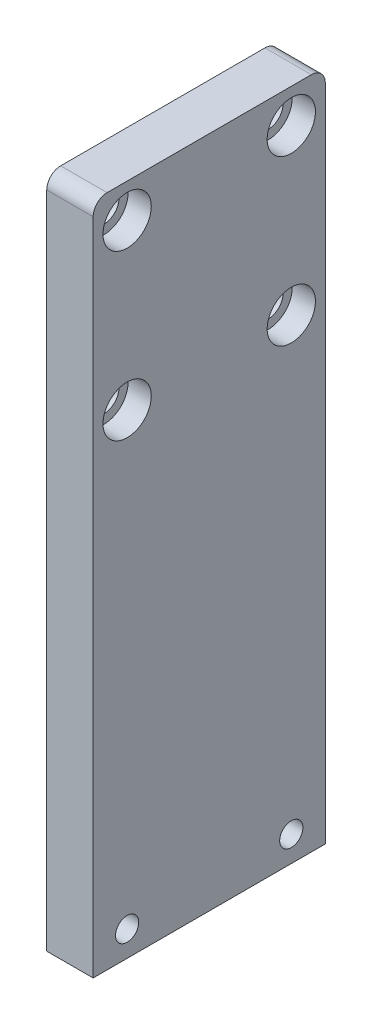
ISO-10303-21;
HEADER;
FILE_DESCRIPTION(('STEP AP214'),'2;1');
FILE_NAME('part.step','',(''),(''),'','','');
FILE_SCHEMA(('AUTOMOTIVE_DESIGN { 1 0 10303 214 1 1 1 1 }'));
ENDSEC;
DATA;
#1=APPLICATION_CONTEXT('core data for automotive mechanical design processes');
#2=APPLICATION_PROTOCOL_DEFINITION('international standard','automotive_design',2000,#1);
#3=PRODUCT_CONTEXT('',#1,'mechanical');
#4=PRODUCT('Part','Part','',(#3));
#5=PRODUCT_RELATED_PRODUCT_CATEGORY('part','',(#4));
#6=PRODUCT_DEFINITION_FORMATION('','',#4);
#7=PRODUCT_DEFINITION_CONTEXT('part definition',#1,'design');
#8=PRODUCT_DEFINITION('design','',#6,#7);
#9=PRODUCT_DEFINITION_SHAPE('','',#8);
#10=(LENGTH_UNIT() NAMED_UNIT(*) SI_UNIT(.MILLI.,.METRE.));
#11=(NAMED_UNIT(*) PLANE_ANGLE_UNIT() SI_UNIT($,.RADIAN.));
#12=(NAMED_UNIT(*) SI_UNIT($,.STERADIAN.) SOLID_ANGLE_UNIT());
#13=UNCERTAINTY_MEASURE_WITH_UNIT(LENGTH_MEASURE(1.E-05),#10,'distance_accuracy_value','');
#14=(GEOMETRIC_REPRESENTATION_CONTEXT(3) GLOBAL_UNCERTAINTY_ASSIGNED_CONTEXT((#13)) GLOBAL_UNIT_ASSIGNED_CONTEXT((#10,
#11,#12)) REPRESENTATION_CONTEXT('',''));
#15=CARTESIAN_POINT('',(0.,0.,0.));
#16=DIRECTION('',(0.,0.,1.));
#17=DIRECTION('',(1.,0.,0.));
#18=AXIS2_PLACEMENT_3D('',#15,#16,#17);
#19=CARTESIAN_POINT('',(10.,17.68,17.68));
#20=DIRECTION('',(-1.,0.,0.));
#21=DIRECTION('',(0.,0.,1.));
#22=AXIS2_PLACEMENT_3D('',#19,#20,#21);
#23=CYLINDRICAL_SURFACE('',#22,3.25);
#24=CARTESIAN_POINT('',(0.,17.68,17.68));
#25=DIRECTION('',(1.,0.,0.));
#26=DIRECTION('',(0.,0.,-1.));
#27=AXIS2_PLACEMENT_3D('',#24,#25,#26);
#28=CIRCLE('',#27,3.25);
#29=CARTESIAN_POINT('',(0.,17.68,14.43));
#30=VERTEX_POINT('',#29);
#31=EDGE_CURVE('E138',#30,#30,#28,.T.);
#32=ORIENTED_EDGE('',*,*,#31,.F.);
#33=EDGE_LOOP('',(#32));
#34=FACE_BOUND('',#33,.T.);
#35=CARTESIAN_POINT('',(5.,17.68,17.68));
#36=DIRECTION('',(1.,0.,0.));
#37=DIRECTION('',(0.,0.,-1.));
#38=AXIS2_PLACEMENT_3D('',#35,#36,#37);
#39=CIRCLE('',#38,3.25);
#40=CARTESIAN_POINT('',(5.,17.68,14.43));
#41=VERTEX_POINT('',#40);
#42=EDGE_CURVE('E159',#41,#41,#39,.T.);
#43=ORIENTED_EDGE('',*,*,#42,.T.);
#44=EDGE_LOOP('',(#43));
#45=FACE_BOUND('',#44,.T.);
#46=ADVANCED_FACE('F46',(#34,#45),#23,.F.);
#47=CARTESIAN_POINT('',(10.,17.68,-17.68));
#48=DIRECTION('',(-1.,0.,0.));
#49=DIRECTION('',(0.,0.,1.));
#50=AXIS2_PLACEMENT_3D('',#47,#48,#49);
#51=CYLINDRICAL_SURFACE('',#50,3.25);
#52=CARTESIAN_POINT('',(0.,17.68,-17.68));
#53=DIRECTION('',(1.,0.,0.));
#54=DIRECTION('',(0.,0.,1.));
#55=AXIS2_PLACEMENT_3D('',#52,#53,#54);
#56=CIRCLE('',#55,3.25);
#57=CARTESIAN_POINT('',(0.,17.68,-14.43));
#58=VERTEX_POINT('',#57);
#59=EDGE_CURVE('E329',#58,#58,#56,.T.);
#60=ORIENTED_EDGE('',*,*,#59,.F.);
#61=EDGE_LOOP('',(#60));
#62=FACE_BOUND('',#61,.T.);
#63=CARTESIAN_POINT('',(5.,17.68,-17.68));
#64=DIRECTION('',(1.,0.,0.));
#65=DIRECTION('',(0.,0.,-1.));
#66=AXIS2_PLACEMENT_3D('',#63,#64,#65);
#67=CIRCLE('',#66,3.25);
#68=CARTESIAN_POINT('',(5.,17.68,-20.93));
#69=VERTEX_POINT('',#68);
#70=EDGE_CURVE('E155',#69,#69,#67,.T.);
#71=ORIENTED_EDGE('',*,*,#70,.T.);
#72=EDGE_LOOP('',(#71));
#73=FACE_BOUND('',#72,.T.);
#74=ADVANCED_FACE('F201',(#62,#73),#51,.F.);
#75=CARTESIAN_POINT('',(10.,-17.68,-17.68));
#76=DIRECTION('',(-1.,0.,0.));
#77=DIRECTION('',(0.,0.,1.));
#78=AXIS2_PLACEMENT_3D('',#75,#76,#77);
#79=CYLINDRICAL_SURFACE('',#78,3.25);
#80=CARTESIAN_POINT('',(0.,-17.68,-17.68));
#81=DIRECTION('',(1.,0.,0.));
#82=DIRECTION('',(0.,0.,-1.));
#83=AXIS2_PLACEMENT_3D('',#80,#81,#82);
#84=CIRCLE('',#83,3.25);
#85=CARTESIAN_POINT('',(0.,-17.68,-20.93));
#86=VERTEX_POINT('',#85);
#87=EDGE_CURVE('E282',#86,#86,#84,.T.);
#88=ORIENTED_EDGE('',*,*,#87,.F.);
#89=EDGE_LOOP('',(#88));
#90=FACE_BOUND('',#89,.T.);
#91=CARTESIAN_POINT('',(5.,-17.68,-17.68));
#92=DIRECTION('',(1.,0.,0.));
#93=DIRECTION('',(0.,0.,-1.));
#94=AXIS2_PLACEMENT_3D('',#91,#92,#93);
#95=CIRCLE('',#94,3.25);
#96=CARTESIAN_POINT('',(5.,-17.68,-20.93));
#97=VERTEX_POINT('',#96);
#98=EDGE_CURVE('E150',#97,#97,#95,.T.);
#99=ORIENTED_EDGE('',*,*,#98,.T.);
#100=EDGE_LOOP('',(#99));
#101=FACE_BOUND('',#100,.T.);
#102=ADVANCED_FACE('F207',(#90,#101),#79,.F.);
#103=CARTESIAN_POINT('',(10.,-17.68,17.68));
#104=DIRECTION('',(-1.,0.,0.));
#105=DIRECTION('',(0.,0.,1.));
#106=AXIS2_PLACEMENT_3D('',#103,#104,#105);
#107=CYLINDRICAL_SURFACE('',#106,3.25);
#108=CARTESIAN_POINT('',(0.,-17.68,17.68));
#109=DIRECTION('',(1.,0.,0.));
#110=DIRECTION('',(0.,0.,1.));
#111=AXIS2_PLACEMENT_3D('',#108,#109,#110);
#112=CIRCLE('',#111,3.25);
#113=CARTESIAN_POINT('',(0.,-17.68,20.93));
#114=VERTEX_POINT('',#113);
#115=EDGE_CURVE('E322',#114,#114,#112,.T.);
#116=ORIENTED_EDGE('',*,*,#115,.F.);
#117=EDGE_LOOP('',(#116));
#118=FACE_BOUND('',#117,.T.);
#119=CARTESIAN_POINT('',(5.,-17.68,17.68));
#120=DIRECTION('',(1.,0.,0.));
#121=DIRECTION('',(0.,0.,-1.));
#122=AXIS2_PLACEMENT_3D('',#119,#120,#121);
#123=CIRCLE('',#122,3.25);
#124=CARTESIAN_POINT('',(5.,-17.68,14.43));
#125=VERTEX_POINT('',#124);
#126=EDGE_CURVE('E146',#125,#125,#123,.T.);
#127=ORIENTED_EDGE('',*,*,#126,.T.);
#128=EDGE_LOOP('',(#127));
#129=FACE_BOUND('',#128,.T.);
#130=ADVANCED_FACE('F216',(#118,#129),#107,.F.);
#131=CARTESIAN_POINT('',(10.,0.,0.));
#132=DIRECTION('',(1.,0.,0.));
#133=DIRECTION('',(0.,0.,-1.));
#134=AXIS2_PLACEMENT_3D('',#131,#132,#133);
#135=PLANE('',#134);
#136=CARTESIAN_POINT('',(10.,-17.68,-17.68));
#137=DIRECTION('',(1.,0.,0.));
#138=DIRECTION('',(0.,0.,-1.));
#139=AXIS2_PLACEMENT_3D('',#136,#137,#138);
#140=CIRCLE('',#139,5.2);
#141=CARTESIAN_POINT('',(10.,-17.68,-22.88));
#142=VERTEX_POINT('',#141);
#143=EDGE_CURVE('E290',#142,#142,#140,.T.);
#144=ORIENTED_EDGE('',*,*,#143,.F.);
#145=EDGE_LOOP('',(#144));
#146=FACE_BOUND('',#145,.T.);
#147=CARTESIAN_POINT('',(10.,-17.68,17.68));
#148=DIRECTION('',(1.,0.,0.));
#149=DIRECTION('',(0.,0.,-1.));
#150=AXIS2_PLACEMENT_3D('',#147,#148,#149);
#151=CIRCLE('',#150,5.2);
#152=CARTESIAN_POINT('',(10.,-17.68,12.48));
#153=VERTEX_POINT('',#152);
#154=EDGE_CURVE('E289',#153,#153,#151,.T.);
#155=ORIENTED_EDGE('',*,*,#154,.F.);
#156=EDGE_LOOP('',(#155));
#157=FACE_BOUND('',#156,.T.);
#158=CARTESIAN_POINT('',(10.,17.68,17.68));
#159=DIRECTION('',(1.,0.,0.));
#160=DIRECTION('',(0.,0.,-1.));
#161=AXIS2_PLACEMENT_3D('',#158,#159,#160);
#162=CIRCLE('',#161,5.2);
#163=CARTESIAN_POINT('',(10.,17.68,12.48));
#164=VERTEX_POINT('',#163);
#165=EDGE_CURVE('E349',#164,#164,#162,.T.);
#166=ORIENTED_EDGE('',*,*,#165,.F.);
#167=EDGE_LOOP('',(#166));
#168=FACE_BOUND('',#167,.T.);
#169=CARTESIAN_POINT('',(10.,17.68,-17.68));
#170=DIRECTION('',(1.,0.,0.));
#171=DIRECTION('',(0.,0.,-1.));
#172=AXIS2_PLACEMENT_3D('',#169,#170,#171);
#173=CIRCLE('',#172,5.2);
#174=CARTESIAN_POINT('',(10.,17.68,-22.88));
#175=VERTEX_POINT('',#174);
#176=EDGE_CURVE('E306',#175,#175,#173,.T.);
#177=ORIENTED_EDGE('',*,*,#176,.F.);
#178=EDGE_LOOP('',(#177));
#179=FACE_BOUND('',#178,.T.);
#180=CARTESIAN_POINT('',(10.,-114.5,17.68));
#181=DIRECTION('',(1.,0.,0.));
#182=DIRECTION('',(0.,0.,-1.));
#183=AXIS2_PLACEMENT_3D('',#180,#181,#182);
#184=CIRCLE('',#183,2.5);
#185=CARTESIAN_POINT('',(10.,-114.5,15.18));
#186=VERTEX_POINT('',#185);
#187=EDGE_CURVE('E318',#186,#186,#184,.T.);
#188=ORIENTED_EDGE('',*,*,#187,.F.);
#189=EDGE_LOOP('',(#188));
#190=FACE_BOUND('',#189,.T.);
#191=DIRECTION('',(0.,1.,0.));
#192=VECTOR('',#191,1.);
#193=CARTESIAN_POINT('',(10.,-120.,-25.));
#194=LINE('',#193,#192);
#195=CARTESIAN_POINT('',(10.,-120.,-25.));
#196=VERTEX_POINT('',#195);
#197=CARTESIAN_POINT('',(10.,22.,-25.));
#198=VERTEX_POINT('',#197);
#199=EDGE_CURVE('E128',#196,#198,#194,.T.);
#200=ORIENTED_EDGE('',*,*,#199,.T.);
#201=CARTESIAN_POINT('',(10.,22.,-22.));
#202=DIRECTION('',(1.,0.,0.));
#203=DIRECTION('',(0.,0.,-1.));
#204=AXIS2_PLACEMENT_3D('',#201,#202,#203);
#205=CIRCLE('',#204,3.);
#206=CARTESIAN_POINT('',(10.,25.,-22.));
#207=VERTEX_POINT('',#206);
#208=EDGE_CURVE('E54',#198,#207,#205,.T.);
#209=ORIENTED_EDGE('',*,*,#208,.T.);
#210=DIRECTION('',(0.,0.,1.));
#211=VECTOR('',#210,1.);
#212=CARTESIAN_POINT('',(10.,25.,25.));
#213=LINE('',#212,#211);
#214=CARTESIAN_POINT('',(10.,25.,22.));
#215=VERTEX_POINT('',#214);
#216=EDGE_CURVE('E112',#207,#215,#213,.T.);
#217=ORIENTED_EDGE('',*,*,#216,.T.);
#218=CARTESIAN_POINT('',(10.,22.,22.));
#219=DIRECTION('',(1.,0.,0.));
#220=DIRECTION('',(0.,0.,-1.));
#221=AXIS2_PLACEMENT_3D('',#218,#219,#220);
#222=CIRCLE('',#221,3.);
#223=CARTESIAN_POINT('',(10.,22.,25.));
#224=VERTEX_POINT('',#223);
#225=EDGE_CURVE('E61',#215,#224,#222,.T.);
#226=ORIENTED_EDGE('',*,*,#225,.T.);
#227=DIRECTION('',(0.,-1.,0.));
#228=VECTOR('',#227,1.);
#229=CARTESIAN_POINT('',(10.,0.,25.));
#230=LINE('',#229,#228);
#231=CARTESIAN_POINT('',(10.,-120.,25.));
#232=VERTEX_POINT('',#231);
#233=EDGE_CURVE('E102',#224,#232,#230,.T.);
#234=ORIENTED_EDGE('',*,*,#233,.T.);
#235=DIRECTION('',(0.,0.,-1.));
#236=VECTOR('',#235,1.);
#237=CARTESIAN_POINT('',(10.,-120.,25.));
#238=LINE('',#237,#236);
#239=EDGE_CURVE('E107',#232,#196,#238,.T.);
#240=ORIENTED_EDGE('',*,*,#239,.T.);
#241=EDGE_LOOP('',(#200,#209,#217,#226,#234,#240));
#242=FACE_BOUND('',#241,.T.);
#243=CARTESIAN_POINT('',(10.,-114.5,-17.68));
#244=DIRECTION('',(1.,0.,0.));
#245=DIRECTION('',(0.,0.,1.));
#246=AXIS2_PLACEMENT_3D('',#243,#244,#245);
#247=CIRCLE('',#246,2.5);
#248=CARTESIAN_POINT('',(10.,-114.5,-15.18));
#249=VERTEX_POINT('',#248);
#250=EDGE_CURVE('E311',#249,#249,#247,.T.);
#251=ORIENTED_EDGE('',*,*,#250,.F.);
#252=EDGE_LOOP('',(#251));
#253=FACE_BOUND('',#252,.T.);
#254=ADVANCED_FACE('F104',(#146,#157,#168,#179,#190,#242,#253),#135,.T.);
#255=CARTESIAN_POINT('',(0.,0.,0.));
#256=DIRECTION('',(1.,0.,0.));
#257=DIRECTION('',(0.,0.,-1.));
#258=AXIS2_PLACEMENT_3D('',#255,#256,#257);
#259=PLANE('',#258);
#260=DIRECTION('',(0.,0.,1.));
#261=VECTOR('',#260,1.);
#262=CARTESIAN_POINT('',(0.,25.,0.));
#263=LINE('',#262,#261);
#264=CARTESIAN_POINT('',(0.,25.,-22.));
#265=VERTEX_POINT('',#264);
#266=CARTESIAN_POINT('',(0.,25.,22.));
#267=VERTEX_POINT('',#266);
#268=EDGE_CURVE('E142',#265,#267,#263,.T.);
#269=ORIENTED_EDGE('',*,*,#268,.F.);
#270=CARTESIAN_POINT('',(0.,22.,-22.));
#271=DIRECTION('',(1.,0.,0.));
#272=DIRECTION('',(0.,0.,-1.));
#273=AXIS2_PLACEMENT_3D('',#270,#271,#272);
#274=CIRCLE('',#273,3.);
#275=CARTESIAN_POINT('',(0.,22.,-25.));
#276=VERTEX_POINT('',#275);
#277=EDGE_CURVE('E170',#265,#276,#274,.F.);
#278=ORIENTED_EDGE('',*,*,#277,.T.);
#279=DIRECTION('',(0.,1.,0.));
#280=VECTOR('',#279,1.);
#281=CARTESIAN_POINT('',(0.,-120.,-25.));
#282=LINE('',#281,#280);
#283=CARTESIAN_POINT('',(0.,-120.,-25.));
#284=VERTEX_POINT('',#283);
#285=EDGE_CURVE('E140',#284,#276,#282,.T.);
#286=ORIENTED_EDGE('',*,*,#285,.F.);
#287=DIRECTION('',(0.,0.,-1.));
#288=VECTOR('',#287,1.);
#289=CARTESIAN_POINT('',(0.,-120.,25.));
#290=LINE('',#289,#288);
#291=CARTESIAN_POINT('',(0.,-120.,25.));
#292=VERTEX_POINT('',#291);
#293=EDGE_CURVE('E137',#292,#284,#290,.T.);
#294=ORIENTED_EDGE('',*,*,#293,.F.);
#295=DIRECTION('',(0.,-1.,0.));
#296=VECTOR('',#295,1.);
#297=CARTESIAN_POINT('',(0.,0.,25.));
#298=LINE('',#297,#296);
#299=CARTESIAN_POINT('',(0.,22.,25.));
#300=VERTEX_POINT('',#299);
#301=EDGE_CURVE('E118',#300,#292,#298,.T.);
#302=ORIENTED_EDGE('',*,*,#301,.F.);
#303=CARTESIAN_POINT('',(0.,22.,22.));
#304=DIRECTION('',(1.,0.,0.));
#305=DIRECTION('',(0.,0.,-1.));
#306=AXIS2_PLACEMENT_3D('',#303,#304,#305);
#307=CIRCLE('',#306,3.);
#308=EDGE_CURVE('E168',#300,#267,#307,.F.);
#309=ORIENTED_EDGE('',*,*,#308,.T.);
#310=EDGE_LOOP('',(#269,#278,#286,#294,#302,#309));
#311=FACE_BOUND('',#310,.T.);
#312=ORIENTED_EDGE('',*,*,#31,.T.);
#313=EDGE_LOOP('',(#312));
#314=FACE_BOUND('',#313,.T.);
#315=ORIENTED_EDGE('',*,*,#59,.T.);
#316=EDGE_LOOP('',(#315));
#317=FACE_BOUND('',#316,.T.);
#318=ORIENTED_EDGE('',*,*,#87,.T.);
#319=EDGE_LOOP('',(#318));
#320=FACE_BOUND('',#319,.T.);
#321=ORIENTED_EDGE('',*,*,#115,.T.);
#322=EDGE_LOOP('',(#321));
#323=FACE_BOUND('',#322,.T.);
#324=CARTESIAN_POINT('',(0.,-114.5,17.68));
#325=DIRECTION('',(1.,0.,0.));
#326=DIRECTION('',(0.,0.,-1.));
#327=AXIS2_PLACEMENT_3D('',#324,#325,#326);
#328=CIRCLE('',#327,2.5);
#329=CARTESIAN_POINT('',(0.,-114.5,15.18));
#330=VERTEX_POINT('',#329);
#331=EDGE_CURVE('E315',#330,#330,#328,.T.);
#332=ORIENTED_EDGE('',*,*,#331,.T.);
#333=EDGE_LOOP('',(#332));
#334=FACE_BOUND('',#333,.T.);
#335=CARTESIAN_POINT('',(0.,-114.5,-17.68));
#336=DIRECTION('',(1.,0.,0.));
#337=DIRECTION('',(0.,0.,1.));
#338=AXIS2_PLACEMENT_3D('',#335,#336,#337);
#339=CIRCLE('',#338,2.5);
#340=CARTESIAN_POINT('',(0.,-114.5,-15.18));
#341=VERTEX_POINT('',#340);
#342=EDGE_CURVE('E163',#341,#341,#339,.T.);
#343=ORIENTED_EDGE('',*,*,#342,.T.);
#344=EDGE_LOOP('',(#343));
#345=FACE_BOUND('',#344,.T.);
#346=ADVANCED_FACE('F188',(#311,#314,#317,#320,#323,#334,#345),#259,.F.);
#347=CARTESIAN_POINT('',(10.,0.,25.));
#348=DIRECTION('',(0.,0.,-1.));
#349=DIRECTION('',(0.,1.,0.));
#350=AXIS2_PLACEMENT_3D('',#347,#348,#349);
#351=PLANE('',#350);
#352=ORIENTED_EDGE('',*,*,#233,.F.);
#353=DIRECTION('',(-1.,0.,0.));
#354=VECTOR('',#353,1.);
#355=CARTESIAN_POINT('',(10.,22.,25.));
#356=LINE('',#355,#354);
#357=EDGE_CURVE('E11',#224,#300,#356,.T.);
#358=ORIENTED_EDGE('',*,*,#357,.T.);
#359=ORIENTED_EDGE('',*,*,#301,.T.);
#360=DIRECTION('',(-1.,0.,0.));
#361=VECTOR('',#360,1.);
#362=CARTESIAN_POINT('',(10.,-120.,25.));
#363=LINE('',#362,#361);
#364=EDGE_CURVE('E115',#232,#292,#363,.T.);
#365=ORIENTED_EDGE('',*,*,#364,.F.);
#366=EDGE_LOOP('',(#352,#358,#359,#365));
#367=FACE_BOUND('',#366,.T.);
#368=ADVANCED_FACE('F116',(#367),#351,.F.);
#369=CARTESIAN_POINT('',(10.,-120.,25.));
#370=DIRECTION('',(0.,1.,0.));
#371=DIRECTION('',(0.,0.,1.));
#372=AXIS2_PLACEMENT_3D('',#369,#370,#371);
#373=PLANE('',#372);
#374=ORIENTED_EDGE('',*,*,#293,.T.);
#375=DIRECTION('',(-1.,0.,0.));
#376=VECTOR('',#375,1.);
#377=CARTESIAN_POINT('',(10.,-120.,-25.));
#378=LINE('',#377,#376);
#379=EDGE_CURVE('E123',#196,#284,#378,.T.);
#380=ORIENTED_EDGE('',*,*,#379,.F.);
#381=ORIENTED_EDGE('',*,*,#239,.F.);
#382=ORIENTED_EDGE('',*,*,#364,.T.);
#383=EDGE_LOOP('',(#374,#380,#381,#382));
#384=FACE_BOUND('',#383,.T.);
#385=ADVANCED_FACE('F125',(#384),#373,.F.);
#386=CARTESIAN_POINT('',(10.,-120.,-25.));
#387=DIRECTION('',(0.,0.,1.));
#388=DIRECTION('',(0.,-1.,0.));
#389=AXIS2_PLACEMENT_3D('',#386,#387,#388);
#390=PLANE('',#389);
#391=ORIENTED_EDGE('',*,*,#285,.T.);
#392=DIRECTION('',(-1.,0.,0.));
#393=VECTOR('',#392,1.);
#394=CARTESIAN_POINT('',(10.,22.,-25.));
#395=LINE('',#394,#393);
#396=EDGE_CURVE('E69',#276,#198,#395,.F.);
#397=ORIENTED_EDGE('',*,*,#396,.T.);
#398=ORIENTED_EDGE('',*,*,#199,.F.);
#399=ORIENTED_EDGE('',*,*,#379,.T.);
#400=EDGE_LOOP('',(#391,#397,#398,#399));
#401=FACE_BOUND('',#400,.T.);
#402=ADVANCED_FACE('F190',(#401),#390,.F.);
#403=CARTESIAN_POINT('',(10.,25.,0.));
#404=DIRECTION('',(0.,-1.,0.));
#405=DIRECTION('',(0.,0.,-1.));
#406=AXIS2_PLACEMENT_3D('',#403,#404,#405);
#407=PLANE('',#406);
#408=ORIENTED_EDGE('',*,*,#216,.F.);
#409=DIRECTION('',(-1.,0.,0.));
#410=VECTOR('',#409,1.);
#411=CARTESIAN_POINT('',(10.,25.,-22.));
#412=LINE('',#411,#410);
#413=EDGE_CURVE('E165',#207,#265,#412,.T.);
#414=ORIENTED_EDGE('',*,*,#413,.T.);
#415=ORIENTED_EDGE('',*,*,#268,.T.);
#416=DIRECTION('',(-1.,0.,0.));
#417=VECTOR('',#416,1.);
#418=CARTESIAN_POINT('',(10.,25.,22.));
#419=LINE('',#418,#417);
#420=EDGE_CURVE('E122',#267,#215,#419,.F.);
#421=ORIENTED_EDGE('',*,*,#420,.T.);
#422=EDGE_LOOP('',(#408,#414,#415,#421));
#423=FACE_BOUND('',#422,.T.);
#424=ADVANCED_FACE('F182',(#423),#407,.F.);
#425=CARTESIAN_POINT('',(10.,-114.5,17.68));
#426=DIRECTION('',(-1.,0.,0.));
#427=DIRECTION('',(0.,0.,1.));
#428=AXIS2_PLACEMENT_3D('',#425,#426,#427);
#429=CYLINDRICAL_SURFACE('',#428,2.5);
#430=ORIENTED_EDGE('',*,*,#187,.T.);
#431=EDGE_LOOP('',(#430));
#432=FACE_BOUND('',#431,.T.);
#433=ORIENTED_EDGE('',*,*,#331,.F.);
#434=EDGE_LOOP('',(#433));
#435=FACE_BOUND('',#434,.T.);
#436=ADVANCED_FACE('F197',(#432,#435),#429,.F.);
#437=CARTESIAN_POINT('',(10.,-114.5,-17.68));
#438=DIRECTION('',(-1.,0.,0.));
#439=DIRECTION('',(0.,0.,1.));
#440=AXIS2_PLACEMENT_3D('',#437,#438,#439);
#441=CYLINDRICAL_SURFACE('',#440,2.5);
#442=ORIENTED_EDGE('',*,*,#250,.T.);
#443=EDGE_LOOP('',(#442));
#444=FACE_BOUND('',#443,.T.);
#445=ORIENTED_EDGE('',*,*,#342,.F.);
#446=EDGE_LOOP('',(#445));
#447=FACE_BOUND('',#446,.T.);
#448=ADVANCED_FACE('F251',(#444,#447),#441,.F.);
#449=CARTESIAN_POINT('',(5.,-17.68,17.68));
#450=DIRECTION('',(1.,0.,0.));
#451=DIRECTION('',(0.,0.,-1.));
#452=AXIS2_PLACEMENT_3D('',#449,#450,#451);
#453=CYLINDRICAL_SURFACE('',#452,5.2);
#454=CARTESIAN_POINT('',(5.,-17.68,17.68));
#455=DIRECTION('',(1.,0.,0.));
#456=DIRECTION('',(0.,0.,-1.));
#457=AXIS2_PLACEMENT_3D('',#454,#455,#456);
#458=CIRCLE('',#457,5.2);
#459=CARTESIAN_POINT('',(5.,-17.68,12.48));
#460=VERTEX_POINT('',#459);
#461=EDGE_CURVE('E297',#460,#460,#458,.T.);
#462=ORIENTED_EDGE('',*,*,#461,.F.);
#463=EDGE_LOOP('',(#462));
#464=FACE_BOUND('',#463,.T.);
#465=ORIENTED_EDGE('',*,*,#154,.T.);
#466=EDGE_LOOP('',(#465));
#467=FACE_BOUND('',#466,.T.);
#468=ADVANCED_FACE('F247',(#464,#467),#453,.F.);
#469=CARTESIAN_POINT('',(5.,-17.68,17.68));
#470=DIRECTION('',(1.,0.,0.));
#471=DIRECTION('',(0.,0.,-1.));
#472=AXIS2_PLACEMENT_3D('',#469,#470,#471);
#473=PLANE('',#472);
#474=ORIENTED_EDGE('',*,*,#126,.F.);
#475=EDGE_LOOP('',(#474));
#476=FACE_BOUND('',#475,.T.);
#477=ORIENTED_EDGE('',*,*,#461,.T.);
#478=EDGE_LOOP('',(#477));
#479=FACE_BOUND('',#478,.T.);
#480=ADVANCED_FACE('F243',(#476,#479),#473,.T.);
#481=CARTESIAN_POINT('',(5.,-17.68,-17.68));
#482=DIRECTION('',(1.,0.,0.));
#483=DIRECTION('',(0.,0.,-1.));
#484=AXIS2_PLACEMENT_3D('',#481,#482,#483);
#485=CYLINDRICAL_SURFACE('',#484,5.2);
#486=CARTESIAN_POINT('',(5.,-17.68,-17.68));
#487=DIRECTION('',(1.,0.,0.));
#488=DIRECTION('',(0.,0.,-1.));
#489=AXIS2_PLACEMENT_3D('',#486,#487,#488);
#490=CIRCLE('',#489,5.2);
#491=CARTESIAN_POINT('',(5.,-17.68,-22.88));
#492=VERTEX_POINT('',#491);
#493=EDGE_CURVE('E287',#492,#492,#490,.T.);
#494=ORIENTED_EDGE('',*,*,#493,.F.);
#495=EDGE_LOOP('',(#494));
#496=FACE_BOUND('',#495,.T.);
#497=ORIENTED_EDGE('',*,*,#143,.T.);
#498=EDGE_LOOP('',(#497));
#499=FACE_BOUND('',#498,.T.);
#500=ADVANCED_FACE('F246',(#496,#499),#485,.F.);
#501=CARTESIAN_POINT('',(5.,-17.68,-17.68));
#502=DIRECTION('',(1.,0.,0.));
#503=DIRECTION('',(0.,0.,-1.));
#504=AXIS2_PLACEMENT_3D('',#501,#502,#503);
#505=PLANE('',#504);
#506=ORIENTED_EDGE('',*,*,#98,.F.);
#507=EDGE_LOOP('',(#506));
#508=FACE_BOUND('',#507,.T.);
#509=ORIENTED_EDGE('',*,*,#493,.T.);
#510=EDGE_LOOP('',(#509));
#511=FACE_BOUND('',#510,.T.);
#512=ADVANCED_FACE('F253',(#508,#511),#505,.T.);
#513=CARTESIAN_POINT('',(5.,17.68,-17.68));
#514=DIRECTION('',(1.,0.,0.));
#515=DIRECTION('',(0.,0.,-1.));
#516=AXIS2_PLACEMENT_3D('',#513,#514,#515);
#517=CYLINDRICAL_SURFACE('',#516,5.2);
#518=CARTESIAN_POINT('',(5.,17.68,-17.68));
#519=DIRECTION('',(1.,0.,0.));
#520=DIRECTION('',(0.,0.,-1.));
#521=AXIS2_PLACEMENT_3D('',#518,#519,#520);
#522=CIRCLE('',#521,5.2);
#523=CARTESIAN_POINT('',(5.,17.68,-22.88));
#524=VERTEX_POINT('',#523);
#525=EDGE_CURVE('E151',#524,#524,#522,.T.);
#526=ORIENTED_EDGE('',*,*,#525,.F.);
#527=EDGE_LOOP('',(#526));
#528=FACE_BOUND('',#527,.T.);
#529=ORIENTED_EDGE('',*,*,#176,.T.);
#530=EDGE_LOOP('',(#529));
#531=FACE_BOUND('',#530,.T.);
#532=ADVANCED_FACE('F256',(#528,#531),#517,.F.);
#533=CARTESIAN_POINT('',(5.,17.68,-17.68));
#534=DIRECTION('',(1.,0.,0.));
#535=DIRECTION('',(0.,0.,-1.));
#536=AXIS2_PLACEMENT_3D('',#533,#534,#535);
#537=PLANE('',#536);
#538=ORIENTED_EDGE('',*,*,#70,.F.);
#539=EDGE_LOOP('',(#538));
#540=FACE_BOUND('',#539,.T.);
#541=ORIENTED_EDGE('',*,*,#525,.T.);
#542=EDGE_LOOP('',(#541));
#543=FACE_BOUND('',#542,.T.);
#544=ADVANCED_FACE('F237',(#540,#543),#537,.T.);
#545=CARTESIAN_POINT('',(5.,17.68,17.68));
#546=DIRECTION('',(1.,0.,0.));
#547=DIRECTION('',(0.,0.,-1.));
#548=AXIS2_PLACEMENT_3D('',#545,#546,#547);
#549=CYLINDRICAL_SURFACE('',#548,5.2);
#550=CARTESIAN_POINT('',(5.,17.68,17.68));
#551=DIRECTION('',(1.,0.,0.));
#552=DIRECTION('',(0.,0.,-1.));
#553=AXIS2_PLACEMENT_3D('',#550,#551,#552);
#554=CIRCLE('',#553,5.2);
#555=CARTESIAN_POINT('',(5.,17.68,12.48));
#556=VERTEX_POINT('',#555);
#557=EDGE_CURVE('E310',#556,#556,#554,.T.);
#558=ORIENTED_EDGE('',*,*,#557,.F.);
#559=EDGE_LOOP('',(#558));
#560=FACE_BOUND('',#559,.T.);
#561=ORIENTED_EDGE('',*,*,#165,.T.);
#562=EDGE_LOOP('',(#561));
#563=FACE_BOUND('',#562,.T.);
#564=ADVANCED_FACE('F232',(#560,#563),#549,.F.);
#565=CARTESIAN_POINT('',(5.,17.68,17.68));
#566=DIRECTION('',(1.,0.,0.));
#567=DIRECTION('',(0.,0.,-1.));
#568=AXIS2_PLACEMENT_3D('',#565,#566,#567);
#569=PLANE('',#568);
#570=ORIENTED_EDGE('',*,*,#42,.F.);
#571=EDGE_LOOP('',(#570));
#572=FACE_BOUND('',#571,.T.);
#573=ORIENTED_EDGE('',*,*,#557,.T.);
#574=EDGE_LOOP('',(#573));
#575=FACE_BOUND('',#574,.T.);
#576=ADVANCED_FACE('F226',(#572,#575),#569,.T.);
#577=CARTESIAN_POINT('',(10.,22.,-22.));
#578=DIRECTION('',(-1.,0.,0.));
#579=DIRECTION('',(0.,0.,1.));
#580=AXIS2_PLACEMENT_3D('',#577,#578,#579);
#581=CYLINDRICAL_SURFACE('',#580,3.);
#582=ORIENTED_EDGE('',*,*,#208,.F.);
#583=ORIENTED_EDGE('',*,*,#396,.F.);
#584=ORIENTED_EDGE('',*,*,#277,.F.);
#585=ORIENTED_EDGE('',*,*,#413,.F.);
#586=EDGE_LOOP('',(#582,#583,#584,#585));
#587=FACE_BOUND('',#586,.T.);
#588=ADVANCED_FACE('F185',(#587),#581,.T.);
#589=CARTESIAN_POINT('',(10.,22.,22.));
#590=DIRECTION('',(-1.,0.,0.));
#591=DIRECTION('',(0.,0.,1.));
#592=AXIS2_PLACEMENT_3D('',#589,#590,#591);
#593=CYLINDRICAL_SURFACE('',#592,3.);
#594=ORIENTED_EDGE('',*,*,#225,.F.);
#595=ORIENTED_EDGE('',*,*,#420,.F.);
#596=ORIENTED_EDGE('',*,*,#308,.F.);
#597=ORIENTED_EDGE('',*,*,#357,.F.);
#598=EDGE_LOOP('',(#594,#595,#596,#597));
#599=FACE_BOUND('',#598,.T.);
#600=ADVANCED_FACE('F48',(#599),#593,.T.);
#601=CLOSED_SHELL('',(#46,#74,#102,#130,#254,#346,#368,#385,#402,#424,#436,#448,#468,#480,#500,
#512,#532,#544,#564,#576,#588,#600));
#602=MANIFOLD_SOLID_BREP('B2',#601);
#603=ADVANCED_BREP_SHAPE_REPRESENTATION('',(#18,#602),#14);
#604=SHAPE_DEFINITION_REPRESENTATION(#9,#603);
ENDSEC;
END-ISO-10303-21;
